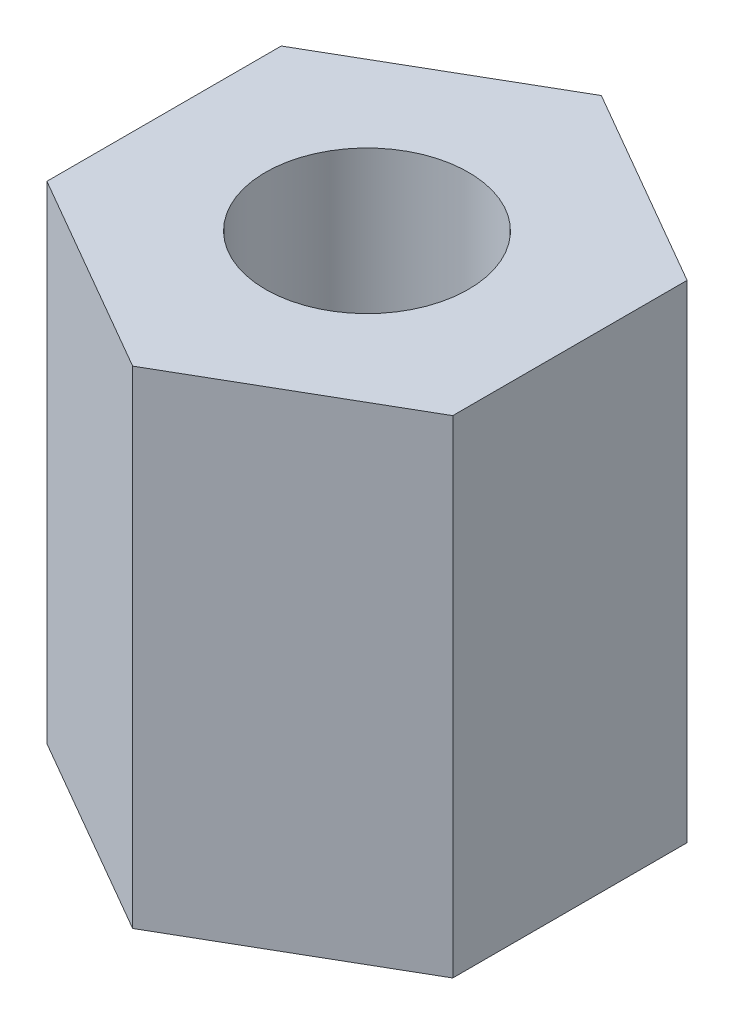
ISO-10303-21;
HEADER;
FILE_DESCRIPTION(('STEP AP214'),'2;1');
FILE_NAME('part.step','',(''),(''),'','','');
FILE_SCHEMA(('AUTOMOTIVE_DESIGN { 1 0 10303 214 1 1 1 1 }'));
ENDSEC;
DATA;
#1=APPLICATION_CONTEXT('core data for automotive mechanical design processes');
#2=APPLICATION_PROTOCOL_DEFINITION('international standard','automotive_design',2000,#1);
#3=PRODUCT_CONTEXT('',#1,'mechanical');
#4=PRODUCT('Part','Part','',(#3));
#5=PRODUCT_RELATED_PRODUCT_CATEGORY('part','',(#4));
#6=PRODUCT_DEFINITION_FORMATION('','',#4);
#7=PRODUCT_DEFINITION_CONTEXT('part definition',#1,'design');
#8=PRODUCT_DEFINITION('design','',#6,#7);
#9=PRODUCT_DEFINITION_SHAPE('','',#8);
#10=(LENGTH_UNIT() NAMED_UNIT(*) SI_UNIT(.MILLI.,.METRE.));
#11=(NAMED_UNIT(*) PLANE_ANGLE_UNIT() SI_UNIT($,.RADIAN.));
#12=(NAMED_UNIT(*) SI_UNIT($,.STERADIAN.) SOLID_ANGLE_UNIT());
#13=UNCERTAINTY_MEASURE_WITH_UNIT(LENGTH_MEASURE(1.E-05),#10,'distance_accuracy_value','');
#14=(GEOMETRIC_REPRESENTATION_CONTEXT(3) GLOBAL_UNCERTAINTY_ASSIGNED_CONTEXT((#13)) GLOBAL_UNIT_ASSIGNED_CONTEXT((#10,
#11,#12)) REPRESENTATION_CONTEXT('',''));
#15=CARTESIAN_POINT('',(0.,0.,0.));
#16=DIRECTION('',(0.,0.,1.));
#17=DIRECTION('',(1.,0.,0.));
#18=AXIS2_PLACEMENT_3D('',#15,#16,#17);
#19=CARTESIAN_POINT('',(0.,6.,0.));
#20=DIRECTION('',(0.,1.,0.));
#21=DIRECTION('',(0.,0.,1.));
#22=AXIS2_PLACEMENT_3D('',#19,#20,#21);
#23=PLANE('',#22);
#24=DIRECTION('',(-0.866025403784441,0.,-0.499999999999995));
#25=VECTOR('',#24,1.);
#26=CARTESIAN_POINT('',(2.49999999999998,6.,-1.44337567297409));
#27=LINE('',#26,#25);
#28=CARTESIAN_POINT('',(2.49999999999998,6.,-1.44337567297409));
#29=VERTEX_POINT('',#28);
#30=CARTESIAN_POINT('',(0.,6.,-2.88675134594813));
#31=VERTEX_POINT('',#30);
#32=EDGE_CURVE('E135',#29,#31,#27,.T.);
#33=ORIENTED_EDGE('',*,*,#32,.T.);
#34=DIRECTION('',(-0.866025403784438,0.,0.500000000000001));
#35=VECTOR('',#34,1.);
#36=CARTESIAN_POINT('',(0.,6.,-2.88675134594813));
#37=LINE('',#36,#35);
#38=CARTESIAN_POINT('',(-2.5,6.,-1.44337567297406));
#39=VERTEX_POINT('',#38);
#40=EDGE_CURVE('E93',#31,#39,#37,.T.);
#41=ORIENTED_EDGE('',*,*,#40,.T.);
#42=DIRECTION('',(0.,0.,1.));
#43=VECTOR('',#42,1.);
#44=CARTESIAN_POINT('',(-2.5,6.,-1.44337567297406));
#45=LINE('',#44,#43);
#46=CARTESIAN_POINT('',(-2.5,6.,1.44337567297408));
#47=VERTEX_POINT('',#46);
#48=EDGE_CURVE('E106',#39,#47,#45,.T.);
#49=ORIENTED_EDGE('',*,*,#48,.T.);
#50=DIRECTION('',(0.866025403784442,0.,0.499999999999995));
#51=VECTOR('',#50,1.);
#52=CARTESIAN_POINT('',(-2.5,6.,1.44337567297408));
#53=LINE('',#52,#51);
#54=CARTESIAN_POINT('',(0.,6.,2.88675134594813));
#55=VERTEX_POINT('',#54);
#56=EDGE_CURVE('E100',#47,#55,#53,.T.);
#57=ORIENTED_EDGE('',*,*,#56,.T.);
#58=DIRECTION('',(0.866025403784435,0.,-0.500000000000007));
#59=VECTOR('',#58,1.);
#60=CARTESIAN_POINT('',(0.,6.,2.88675134594813));
#61=LINE('',#60,#59);
#62=CARTESIAN_POINT('',(2.50000000000001,6.,1.44337567297404));
#63=VERTEX_POINT('',#62);
#64=EDGE_CURVE('E104',#55,#63,#61,.T.);
#65=ORIENTED_EDGE('',*,*,#64,.T.);
#66=DIRECTION('',(0.,0.,-1.));
#67=VECTOR('',#66,1.);
#68=CARTESIAN_POINT('',(2.50000000000001,6.,1.44337567297404));
#69=LINE('',#68,#67);
#70=EDGE_CURVE('E56',#63,#29,#69,.T.);
#71=ORIENTED_EDGE('',*,*,#70,.T.);
#72=EDGE_LOOP('',(#33,#41,#49,#57,#65,#71));
#73=FACE_BOUND('',#72,.T.);
#74=CARTESIAN_POINT('',(0.,6.,0.));
#75=DIRECTION('',(0.,1.,0.));
#76=DIRECTION('',(0.,0.,1.));
#77=AXIS2_PLACEMENT_3D('',#74,#75,#76);
#78=CIRCLE('',#77,1.25);
#79=CARTESIAN_POINT('',(0.,6.,1.25));
#80=VERTEX_POINT('',#79);
#81=EDGE_CURVE('E128',#80,#80,#78,.T.);
#82=ORIENTED_EDGE('',*,*,#81,.F.);
#83=EDGE_LOOP('',(#82));
#84=FACE_BOUND('',#83,.T.);
#85=ADVANCED_FACE('F39',(#73,#84),#23,.T.);
#86=CARTESIAN_POINT('',(0.,0.,0.));
#87=DIRECTION('',(0.,1.,0.));
#88=DIRECTION('',(0.,0.,1.));
#89=AXIS2_PLACEMENT_3D('',#86,#87,#88);
#90=PLANE('',#89);
#91=DIRECTION('',(-0.866025403784441,0.,-0.499999999999995));
#92=VECTOR('',#91,1.);
#93=CARTESIAN_POINT('',(2.49999999999998,0.,-1.44337567297409));
#94=LINE('',#93,#92);
#95=CARTESIAN_POINT('',(2.49999999999998,0.,-1.44337567297409));
#96=VERTEX_POINT('',#95);
#97=CARTESIAN_POINT('',(0.,0.,-2.88675134594813));
#98=VERTEX_POINT('',#97);
#99=EDGE_CURVE('E124',#96,#98,#94,.T.);
#100=ORIENTED_EDGE('',*,*,#99,.F.);
#101=DIRECTION('',(0.,0.,-1.));
#102=VECTOR('',#101,1.);
#103=CARTESIAN_POINT('',(2.50000000000001,0.,1.44337567297404));
#104=LINE('',#103,#102);
#105=CARTESIAN_POINT('',(2.50000000000001,0.,1.44337567297404));
#106=VERTEX_POINT('',#105);
#107=EDGE_CURVE('E85',#106,#96,#104,.T.);
#108=ORIENTED_EDGE('',*,*,#107,.F.);
#109=DIRECTION('',(0.866025403784435,0.,-0.500000000000007));
#110=VECTOR('',#109,1.);
#111=CARTESIAN_POINT('',(0.,0.,2.88675134594813));
#112=LINE('',#111,#110);
#113=CARTESIAN_POINT('',(0.,0.,2.88675134594813));
#114=VERTEX_POINT('',#113);
#115=EDGE_CURVE('E79',#114,#106,#112,.T.);
#116=ORIENTED_EDGE('',*,*,#115,.F.);
#117=DIRECTION('',(0.866025403784442,0.,0.499999999999995));
#118=VECTOR('',#117,1.);
#119=CARTESIAN_POINT('',(-2.5,0.,1.44337567297408));
#120=LINE('',#119,#118);
#121=CARTESIAN_POINT('',(-2.5,0.,1.44337567297408));
#122=VERTEX_POINT('',#121);
#123=EDGE_CURVE('E114',#122,#114,#120,.T.);
#124=ORIENTED_EDGE('',*,*,#123,.F.);
#125=DIRECTION('',(0.,0.,1.));
#126=VECTOR('',#125,1.);
#127=CARTESIAN_POINT('',(-2.5,0.,-1.44337567297406));
#128=LINE('',#127,#126);
#129=CARTESIAN_POINT('',(-2.5,0.,-1.44337567297406));
#130=VERTEX_POINT('',#129);
#131=EDGE_CURVE('E130',#130,#122,#128,.T.);
#132=ORIENTED_EDGE('',*,*,#131,.F.);
#133=DIRECTION('',(-0.866025403784438,0.,0.500000000000001));
#134=VECTOR('',#133,1.);
#135=CARTESIAN_POINT('',(0.,0.,-2.88675134594813));
#136=LINE('',#135,#134);
#137=EDGE_CURVE('E127',#98,#130,#136,.T.);
#138=ORIENTED_EDGE('',*,*,#137,.F.);
#139=EDGE_LOOP('',(#100,#108,#116,#124,#132,#138));
#140=FACE_BOUND('',#139,.T.);
#141=CARTESIAN_POINT('',(0.,0.,0.));
#142=DIRECTION('',(0.,1.,0.));
#143=DIRECTION('',(0.,0.,1.));
#144=AXIS2_PLACEMENT_3D('',#141,#142,#143);
#145=CIRCLE('',#144,1.25);
#146=CARTESIAN_POINT('',(0.,0.,1.25));
#147=VERTEX_POINT('',#146);
#148=EDGE_CURVE('E246',#147,#147,#145,.T.);
#149=ORIENTED_EDGE('',*,*,#148,.T.);
#150=EDGE_LOOP('',(#149));
#151=FACE_BOUND('',#150,.T.);
#152=ADVANCED_FACE('F144',(#140,#151),#90,.F.);
#153=CARTESIAN_POINT('',(2.49999999999998,6.,-1.44337567297409));
#154=DIRECTION('',(-0.499999999999995,0.,0.866025403784441));
#155=DIRECTION('',(0.866025403784441,0.,0.499999999999995));
#156=AXIS2_PLACEMENT_3D('',#153,#154,#155);
#157=PLANE('',#156);
#158=ORIENTED_EDGE('',*,*,#99,.T.);
#159=DIRECTION('',(0.,-1.,0.));
#160=VECTOR('',#159,1.);
#161=CARTESIAN_POINT('',(0.,6.,-2.88675134594813));
#162=LINE('',#161,#160);
#163=EDGE_CURVE('E11',#31,#98,#162,.T.);
#164=ORIENTED_EDGE('',*,*,#163,.F.);
#165=ORIENTED_EDGE('',*,*,#32,.F.);
#166=DIRECTION('',(0.,-1.,0.));
#167=VECTOR('',#166,1.);
#168=CARTESIAN_POINT('',(2.49999999999998,6.,-1.44337567297409));
#169=LINE('',#168,#167);
#170=EDGE_CURVE('E120',#29,#96,#169,.T.);
#171=ORIENTED_EDGE('',*,*,#170,.T.);
#172=EDGE_LOOP('',(#158,#164,#165,#171));
#173=FACE_BOUND('',#172,.T.);
#174=ADVANCED_FACE('F41',(#173),#157,.F.);
#175=CARTESIAN_POINT('',(0.,6.,-2.88675134594813));
#176=DIRECTION('',(0.500000000000001,0.,0.866025403784438));
#177=DIRECTION('',(0.866025403784438,0.,-0.500000000000001));
#178=AXIS2_PLACEMENT_3D('',#175,#176,#177);
#179=PLANE('',#178);
#180=ORIENTED_EDGE('',*,*,#137,.T.);
#181=DIRECTION('',(0.,-1.,0.));
#182=VECTOR('',#181,1.);
#183=CARTESIAN_POINT('',(-2.5,6.,-1.44337567297406));
#184=LINE('',#183,#182);
#185=EDGE_CURVE('E48',#39,#130,#184,.T.);
#186=ORIENTED_EDGE('',*,*,#185,.F.);
#187=ORIENTED_EDGE('',*,*,#40,.F.);
#188=ORIENTED_EDGE('',*,*,#163,.T.);
#189=EDGE_LOOP('',(#180,#186,#187,#188));
#190=FACE_BOUND('',#189,.T.);
#191=ADVANCED_FACE('F169',(#190),#179,.F.);
#192=CARTESIAN_POINT('',(-2.5,6.,-1.44337567297406));
#193=DIRECTION('',(1.,0.,0.));
#194=DIRECTION('',(0.,0.,-1.));
#195=AXIS2_PLACEMENT_3D('',#192,#193,#194);
#196=PLANE('',#195);
#197=ORIENTED_EDGE('',*,*,#131,.T.);
#198=DIRECTION('',(0.,-1.,0.));
#199=VECTOR('',#198,1.);
#200=CARTESIAN_POINT('',(-2.5,6.,1.44337567297408));
#201=LINE('',#200,#199);
#202=EDGE_CURVE('E115',#47,#122,#201,.T.);
#203=ORIENTED_EDGE('',*,*,#202,.F.);
#204=ORIENTED_EDGE('',*,*,#48,.F.);
#205=ORIENTED_EDGE('',*,*,#185,.T.);
#206=EDGE_LOOP('',(#197,#203,#204,#205));
#207=FACE_BOUND('',#206,.T.);
#208=ADVANCED_FACE('F141',(#207),#196,.F.);
#209=CARTESIAN_POINT('',(-2.5,6.,1.44337567297408));
#210=DIRECTION('',(0.499999999999995,0.,-0.866025403784441));
#211=DIRECTION('',(-0.866025403784442,0.,-0.499999999999995));
#212=AXIS2_PLACEMENT_3D('',#209,#210,#211);
#213=PLANE('',#212);
#214=ORIENTED_EDGE('',*,*,#123,.T.);
#215=DIRECTION('',(0.,-1.,0.));
#216=VECTOR('',#215,1.);
#217=CARTESIAN_POINT('',(0.,6.,2.88675134594813));
#218=LINE('',#217,#216);
#219=EDGE_CURVE('E111',#55,#114,#218,.T.);
#220=ORIENTED_EDGE('',*,*,#219,.F.);
#221=ORIENTED_EDGE('',*,*,#56,.F.);
#222=ORIENTED_EDGE('',*,*,#202,.T.);
#223=EDGE_LOOP('',(#214,#220,#221,#222));
#224=FACE_BOUND('',#223,.T.);
#225=ADVANCED_FACE('F112',(#224),#213,.F.);
#226=CARTESIAN_POINT('',(0.,6.,2.88675134594813));
#227=DIRECTION('',(-0.500000000000007,0.,-0.866025403784435));
#228=DIRECTION('',(-0.866025403784435,0.,0.500000000000007));
#229=AXIS2_PLACEMENT_3D('',#226,#227,#228);
#230=PLANE('',#229);
#231=ORIENTED_EDGE('',*,*,#115,.T.);
#232=DIRECTION('',(0.,-1.,0.));
#233=VECTOR('',#232,1.);
#234=CARTESIAN_POINT('',(2.50000000000001,6.,1.44337567297404));
#235=LINE('',#234,#233);
#236=EDGE_CURVE('E116',#63,#106,#235,.T.);
#237=ORIENTED_EDGE('',*,*,#236,.F.);
#238=ORIENTED_EDGE('',*,*,#64,.F.);
#239=ORIENTED_EDGE('',*,*,#219,.T.);
#240=EDGE_LOOP('',(#231,#237,#238,#239));
#241=FACE_BOUND('',#240,.T.);
#242=ADVANCED_FACE('F118',(#241),#230,.F.);
#243=CARTESIAN_POINT('',(2.50000000000001,6.,1.44337567297404));
#244=DIRECTION('',(-1.,0.,0.));
#245=DIRECTION('',(0.,0.,1.));
#246=AXIS2_PLACEMENT_3D('',#243,#244,#245);
#247=PLANE('',#246);
#248=ORIENTED_EDGE('',*,*,#107,.T.);
#249=ORIENTED_EDGE('',*,*,#170,.F.);
#250=ORIENTED_EDGE('',*,*,#70,.F.);
#251=ORIENTED_EDGE('',*,*,#236,.T.);
#252=EDGE_LOOP('',(#248,#249,#250,#251));
#253=FACE_BOUND('',#252,.T.);
#254=ADVANCED_FACE('F149',(#253),#247,.F.);
#255=CARTESIAN_POINT('',(0.,6.,0.));
#256=DIRECTION('',(0.,-1.,0.));
#257=DIRECTION('',(0.,0.,-1.));
#258=AXIS2_PLACEMENT_3D('',#255,#256,#257);
#259=CYLINDRICAL_SURFACE('',#258,1.25);
#260=ORIENTED_EDGE('',*,*,#81,.T.);
#261=EDGE_LOOP('',(#260));
#262=FACE_BOUND('',#261,.T.);
#263=ORIENTED_EDGE('',*,*,#148,.F.);
#264=EDGE_LOOP('',(#263));
#265=FACE_BOUND('',#264,.T.);
#266=ADVANCED_FACE('F151',(#262,#265),#259,.F.);
#267=CLOSED_SHELL('',(#85,#152,#174,#191,#208,#225,#242,#254,#266));
#268=MANIFOLD_SOLID_BREP('B2',#267);
#269=ADVANCED_BREP_SHAPE_REPRESENTATION('',(#18,#268),#14);
#270=SHAPE_DEFINITION_REPRESENTATION(#9,#269);
ENDSEC;
END-ISO-10303-21;
